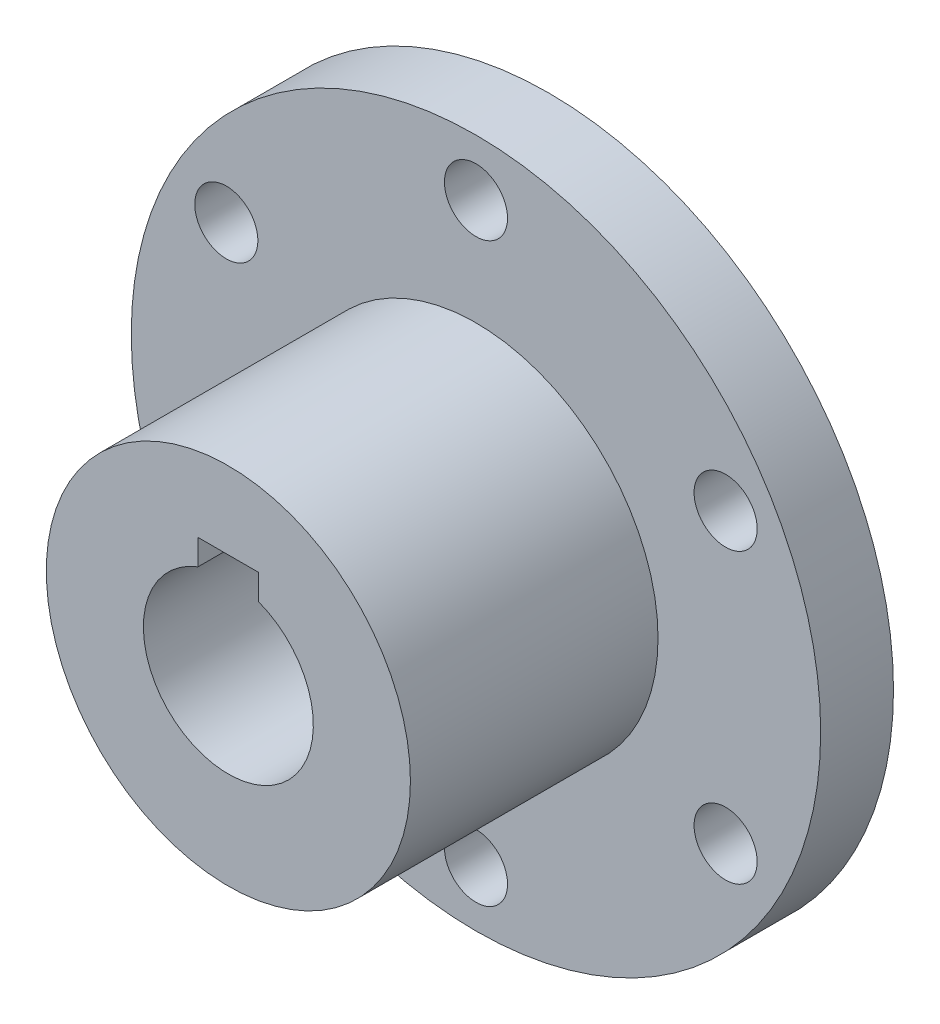
ISO-10303-21;
HEADER;
FILE_DESCRIPTION(('STEP AP214'),'2;1');
FILE_NAME('part.step','',(''),(''),'','','');
FILE_SCHEMA(('AUTOMOTIVE_DESIGN { 1 0 10303 214 1 1 1 1 }'));
ENDSEC;
DATA;
#1=APPLICATION_CONTEXT('core data for automotive mechanical design processes');
#2=APPLICATION_PROTOCOL_DEFINITION('international standard','automotive_design',2000,#1);
#3=PRODUCT_CONTEXT('',#1,'mechanical');
#4=PRODUCT('Part','Part','',(#3));
#5=PRODUCT_RELATED_PRODUCT_CATEGORY('part','',(#4));
#6=PRODUCT_DEFINITION_FORMATION('','',#4);
#7=PRODUCT_DEFINITION_CONTEXT('part definition',#1,'design');
#8=PRODUCT_DEFINITION('design','',#6,#7);
#9=PRODUCT_DEFINITION_SHAPE('','',#8);
#10=(LENGTH_UNIT() NAMED_UNIT(*) SI_UNIT(.MILLI.,.METRE.));
#11=(NAMED_UNIT(*) PLANE_ANGLE_UNIT() SI_UNIT($,.RADIAN.));
#12=(NAMED_UNIT(*) SI_UNIT($,.STERADIAN.) SOLID_ANGLE_UNIT());
#13=UNCERTAINTY_MEASURE_WITH_UNIT(LENGTH_MEASURE(1.E-05),#10,'distance_accuracy_value','');
#14=(GEOMETRIC_REPRESENTATION_CONTEXT(3) GLOBAL_UNCERTAINTY_ASSIGNED_CONTEXT((#13)) GLOBAL_UNIT_ASSIGNED_CONTEXT((#10,
#11,#12)) REPRESENTATION_CONTEXT('',''));
#15=CARTESIAN_POINT('',(0.,0.,0.));
#16=DIRECTION('',(0.,0.,1.));
#17=DIRECTION('',(1.,0.,0.));
#18=AXIS2_PLACEMENT_3D('',#15,#16,#17);
#19=CARTESIAN_POINT('',(0.,8.73301489862968,6.));
#20=DIRECTION('',(0.,0.,-1.));
#21=DIRECTION('',(-1.,0.,0.));
#22=AXIS2_PLACEMENT_3D('',#19,#20,#21);
#23=CYLINDRICAL_SURFACE('',#22,28.4);
#24=CARTESIAN_POINT('',(0.,8.73301489862968,6.));
#25=DIRECTION('',(0.,0.,1.));
#26=DIRECTION('',(1.,0.,0.));
#27=AXIS2_PLACEMENT_3D('',#24,#25,#26);
#28=CIRCLE('',#27,28.4);
#29=CARTESIAN_POINT('',(28.4,8.73301489862968,6.));
#30=VERTEX_POINT('',#29);
#31=EDGE_CURVE('E11',#30,#30,#28,.T.);
#32=ORIENTED_EDGE('',*,*,#31,.F.);
#33=EDGE_LOOP('',(#32));
#34=FACE_BOUND('',#33,.T.);
#35=CARTESIAN_POINT('',(0.,8.73301489862968,0.));
#36=DIRECTION('',(0.,0.,1.));
#37=DIRECTION('',(1.,0.,0.));
#38=AXIS2_PLACEMENT_3D('',#35,#36,#37);
#39=CIRCLE('',#38,28.4);
#40=CARTESIAN_POINT('',(28.4,8.73301489862968,0.));
#41=VERTEX_POINT('',#40);
#42=EDGE_CURVE('E38',#41,#41,#39,.T.);
#43=ORIENTED_EDGE('',*,*,#42,.T.);
#44=EDGE_LOOP('',(#43));
#45=FACE_BOUND('',#44,.T.);
#46=ADVANCED_FACE('F35',(#34,#45),#23,.T.);
#47=CARTESIAN_POINT('',(0.,8.73301489862968,6.));
#48=DIRECTION('',(0.,0.,1.));
#49=DIRECTION('',(1.,0.,0.));
#50=AXIS2_PLACEMENT_3D('',#47,#48,#49);
#51=PLANE('',#50);
#52=CARTESIAN_POINT('',(20.5681033398809,20.6080148986305,6.));
#53=DIRECTION('',(0.,0.,1.));
#54=DIRECTION('',(1.,0.,0.));
#55=AXIS2_PLACEMENT_3D('',#52,#53,#54);
#56=CIRCLE('',#55,2.6);
#57=CARTESIAN_POINT('',(23.168103339881,20.6080148986305,6.));
#58=VERTEX_POINT('',#57);
#59=EDGE_CURVE('E189',#58,#58,#56,.T.);
#60=ORIENTED_EDGE('',*,*,#59,.F.);
#61=EDGE_LOOP('',(#60));
#62=FACE_BOUND('',#61,.T.);
#63=CARTESIAN_POINT('',(20.5681033398819,-3.14198510136954,6.));
#64=DIRECTION('',(0.,0.,1.));
#65=DIRECTION('',(1.,0.,0.));
#66=AXIS2_PLACEMENT_3D('',#63,#64,#65);
#67=CIRCLE('',#66,2.6);
#68=CARTESIAN_POINT('',(23.1681033398819,-3.14198510136954,6.));
#69=VERTEX_POINT('',#68);
#70=EDGE_CURVE('E195',#69,#69,#67,.T.);
#71=ORIENTED_EDGE('',*,*,#70,.F.);
#72=EDGE_LOOP('',(#71));
#73=FACE_BOUND('',#72,.T.);
#74=CARTESIAN_POINT('',(1.85047582487731E-12,-15.0169851013703,6.));
#75=DIRECTION('',(0.,0.,1.));
#76=DIRECTION('',(1.,0.,0.));
#77=AXIS2_PLACEMENT_3D('',#74,#75,#76);
#78=CIRCLE('',#77,2.6);
#79=CARTESIAN_POINT('',(2.60000000000185,-15.0169851013703,6.));
#80=VERTEX_POINT('',#79);
#81=EDGE_CURVE('E203',#80,#80,#78,.T.);
#82=ORIENTED_EDGE('',*,*,#81,.F.);
#83=EDGE_LOOP('',(#82));
#84=FACE_BOUND('',#83,.T.);
#85=CARTESIAN_POINT('',(-20.568103339879,-3.14198510137101,6.));
#86=DIRECTION('',(0.,0.,1.));
#87=DIRECTION('',(1.,0.,0.));
#88=AXIS2_PLACEMENT_3D('',#85,#86,#87);
#89=CIRCLE('',#88,2.6);
#90=CARTESIAN_POINT('',(-17.968103339879,-3.14198510137101,6.));
#91=VERTEX_POINT('',#90);
#92=EDGE_CURVE('E209',#91,#91,#89,.T.);
#93=ORIENTED_EDGE('',*,*,#92,.F.);
#94=EDGE_LOOP('',(#93));
#95=FACE_BOUND('',#94,.T.);
#96=CARTESIAN_POINT('',(-20.5681033398798,20.6080148986291,6.));
#97=DIRECTION('',(0.,0.,1.));
#98=DIRECTION('',(1.,0.,0.));
#99=AXIS2_PLACEMENT_3D('',#96,#97,#98);
#100=CIRCLE('',#99,2.6);
#101=CARTESIAN_POINT('',(-17.9681033398798,20.6080148986291,6.));
#102=VERTEX_POINT('',#101);
#103=EDGE_CURVE('E215',#102,#102,#100,.T.);
#104=ORIENTED_EDGE('',*,*,#103,.F.);
#105=EDGE_LOOP('',(#104));
#106=FACE_BOUND('',#105,.T.);
#107=CARTESIAN_POINT('',(0.,32.4830148986297,6.));
#108=DIRECTION('',(0.,0.,1.));
#109=DIRECTION('',(1.,0.,0.));
#110=AXIS2_PLACEMENT_3D('',#107,#108,#109);
#111=CIRCLE('',#110,2.6);
#112=CARTESIAN_POINT('',(2.6,32.4830148986297,6.));
#113=VERTEX_POINT('',#112);
#114=EDGE_CURVE('E192',#113,#113,#111,.T.);
#115=ORIENTED_EDGE('',*,*,#114,.F.);
#116=EDGE_LOOP('',(#115));
#117=FACE_BOUND('',#116,.T.);
#118=CARTESIAN_POINT('',(0.,8.73301489862969,6.));
#119=DIRECTION('',(0.,0.,1.));
#120=DIRECTION('',(1.,0.,0.));
#121=AXIS2_PLACEMENT_3D('',#118,#119,#120);
#122=CIRCLE('',#121,15.);
#123=CARTESIAN_POINT('',(15.,8.73301489862969,6.));
#124=VERTEX_POINT('',#123);
#125=EDGE_CURVE('E112',#124,#124,#122,.T.);
#126=ORIENTED_EDGE('',*,*,#125,.F.);
#127=EDGE_LOOP('',(#126));
#128=FACE_BOUND('',#127,.T.);
#129=ORIENTED_EDGE('',*,*,#31,.T.);
#130=EDGE_LOOP('',(#129));
#131=FACE_BOUND('',#130,.T.);
#132=ADVANCED_FACE('F123',(#62,#73,#84,#95,#106,#117,#128,#131),#51,.T.);
#133=CARTESIAN_POINT('',(0.,8.73301489862968,0.));
#134=DIRECTION('',(0.,0.,1.));
#135=DIRECTION('',(1.,0.,0.));
#136=AXIS2_PLACEMENT_3D('',#133,#134,#135);
#137=PLANE('',#136);
#138=CARTESIAN_POINT('',(20.5681033398809,20.6080148986305,0.));
#139=DIRECTION('',(0.,0.,1.));
#140=DIRECTION('',(1.,0.,0.));
#141=AXIS2_PLACEMENT_3D('',#138,#139,#140);
#142=CIRCLE('',#141,2.6);
#143=CARTESIAN_POINT('',(23.168103339881,20.6080148986305,0.));
#144=VERTEX_POINT('',#143);
#145=EDGE_CURVE('E186',#144,#144,#142,.T.);
#146=ORIENTED_EDGE('',*,*,#145,.T.);
#147=EDGE_LOOP('',(#146));
#148=FACE_BOUND('',#147,.T.);
#149=CARTESIAN_POINT('',(20.5681033398819,-3.14198510136954,0.));
#150=DIRECTION('',(0.,0.,1.));
#151=DIRECTION('',(1.,0.,0.));
#152=AXIS2_PLACEMENT_3D('',#149,#150,#151);
#153=CIRCLE('',#152,2.6);
#154=CARTESIAN_POINT('',(23.1681033398819,-3.14198510136954,0.));
#155=VERTEX_POINT('',#154);
#156=EDGE_CURVE('E190',#155,#155,#153,.T.);
#157=ORIENTED_EDGE('',*,*,#156,.T.);
#158=EDGE_LOOP('',(#157));
#159=FACE_BOUND('',#158,.T.);
#160=CARTESIAN_POINT('',(1.85047582487731E-12,-15.0169851013703,0.));
#161=DIRECTION('',(0.,0.,1.));
#162=DIRECTION('',(1.,0.,0.));
#163=AXIS2_PLACEMENT_3D('',#160,#161,#162);
#164=CIRCLE('',#163,2.6);
#165=CARTESIAN_POINT('',(2.60000000000185,-15.0169851013703,0.));
#166=VERTEX_POINT('',#165);
#167=EDGE_CURVE('E200',#166,#166,#164,.T.);
#168=ORIENTED_EDGE('',*,*,#167,.T.);
#169=EDGE_LOOP('',(#168));
#170=FACE_BOUND('',#169,.T.);
#171=CARTESIAN_POINT('',(-20.568103339879,-3.14198510137101,0.));
#172=DIRECTION('',(0.,0.,1.));
#173=DIRECTION('',(1.,0.,0.));
#174=AXIS2_PLACEMENT_3D('',#171,#172,#173);
#175=CIRCLE('',#174,2.6);
#176=CARTESIAN_POINT('',(-17.968103339879,-3.14198510137101,0.));
#177=VERTEX_POINT('',#176);
#178=EDGE_CURVE('E206',#177,#177,#175,.T.);
#179=ORIENTED_EDGE('',*,*,#178,.T.);
#180=EDGE_LOOP('',(#179));
#181=FACE_BOUND('',#180,.T.);
#182=CARTESIAN_POINT('',(-20.5681033398798,20.6080148986291,0.));
#183=DIRECTION('',(0.,0.,1.));
#184=DIRECTION('',(1.,0.,0.));
#185=AXIS2_PLACEMENT_3D('',#182,#183,#184);
#186=CIRCLE('',#185,2.6);
#187=CARTESIAN_POINT('',(-17.9681033398798,20.6080148986291,0.));
#188=VERTEX_POINT('',#187);
#189=EDGE_CURVE('E212',#188,#188,#186,.T.);
#190=ORIENTED_EDGE('',*,*,#189,.T.);
#191=EDGE_LOOP('',(#190));
#192=FACE_BOUND('',#191,.T.);
#193=CARTESIAN_POINT('',(0.,32.4830148986297,0.));
#194=DIRECTION('',(0.,0.,1.));
#195=DIRECTION('',(1.,0.,0.));
#196=AXIS2_PLACEMENT_3D('',#193,#194,#195);
#197=CIRCLE('',#196,2.6);
#198=CARTESIAN_POINT('',(2.6,32.4830148986297,0.));
#199=VERTEX_POINT('',#198);
#200=EDGE_CURVE('E103',#199,#199,#197,.T.);
#201=ORIENTED_EDGE('',*,*,#200,.T.);
#202=EDGE_LOOP('',(#201));
#203=FACE_BOUND('',#202,.T.);
#204=CARTESIAN_POINT('',(0.,8.73301489862969,0.));
#205=DIRECTION('',(0.,0.,1.));
#206=DIRECTION('',(1.,0.,0.));
#207=AXIS2_PLACEMENT_3D('',#204,#205,#206);
#208=CIRCLE('',#207,7.);
#209=CARTESIAN_POINT('',(-2.5,15.2713633139407,0.));
#210=VERTEX_POINT('',#209);
#211=CARTESIAN_POINT('',(2.5,15.2713633139407,0.));
#212=VERTEX_POINT('',#211);
#213=EDGE_CURVE('E110',#210,#212,#208,.T.);
#214=ORIENTED_EDGE('',*,*,#213,.T.);
#215=DIRECTION('',(0.,1.,0.));
#216=VECTOR('',#215,1.);
#217=CARTESIAN_POINT('',(2.5,17.3713633139407,0.));
#218=LINE('',#217,#216);
#219=CARTESIAN_POINT('',(2.5,17.3713633139407,0.));
#220=VERTEX_POINT('',#219);
#221=EDGE_CURVE('E58',#212,#220,#218,.T.);
#222=ORIENTED_EDGE('',*,*,#221,.T.);
#223=DIRECTION('',(-1.,0.,0.));
#224=VECTOR('',#223,1.);
#225=CARTESIAN_POINT('',(-2.5,17.3713633139407,0.));
#226=LINE('',#225,#224);
#227=CARTESIAN_POINT('',(-2.5,17.3713633139407,0.));
#228=VERTEX_POINT('',#227);
#229=EDGE_CURVE('E83',#220,#228,#226,.T.);
#230=ORIENTED_EDGE('',*,*,#229,.T.);
#231=DIRECTION('',(0.,-1.,0.));
#232=VECTOR('',#231,1.);
#233=CARTESIAN_POINT('',(-2.5,15.2713633139407,0.));
#234=LINE('',#233,#232);
#235=EDGE_CURVE('E89',#228,#210,#234,.T.);
#236=ORIENTED_EDGE('',*,*,#235,.T.);
#237=EDGE_LOOP('',(#214,#222,#230,#236));
#238=FACE_BOUND('',#237,.T.);
#239=ORIENTED_EDGE('',*,*,#42,.F.);
#240=EDGE_LOOP('',(#239));
#241=FACE_BOUND('',#240,.T.);
#242=ADVANCED_FACE('F95',(#148,#159,#170,#181,#192,#203,#238,#241),#137,.F.);
#243=CARTESIAN_POINT('',(0.,8.73301489862969,26.4));
#244=DIRECTION('',(0.,0.,-1.));
#245=DIRECTION('',(-1.,0.,0.));
#246=AXIS2_PLACEMENT_3D('',#243,#244,#245);
#247=CYLINDRICAL_SURFACE('',#246,15.);
#248=CARTESIAN_POINT('',(0.,8.73301489862969,26.4));
#249=DIRECTION('',(0.,0.,1.));
#250=DIRECTION('',(1.,0.,0.));
#251=AXIS2_PLACEMENT_3D('',#248,#249,#250);
#252=CIRCLE('',#251,15.);
#253=CARTESIAN_POINT('',(15.,8.73301489862969,26.4));
#254=VERTEX_POINT('',#253);
#255=EDGE_CURVE('E115',#254,#254,#252,.T.);
#256=ORIENTED_EDGE('',*,*,#255,.F.);
#257=EDGE_LOOP('',(#256));
#258=FACE_BOUND('',#257,.T.);
#259=ORIENTED_EDGE('',*,*,#125,.T.);
#260=EDGE_LOOP('',(#259));
#261=FACE_BOUND('',#260,.T.);
#262=ADVANCED_FACE('F121',(#258,#261),#247,.T.);
#263=CARTESIAN_POINT('',(0.,8.73301489862969,26.4));
#264=DIRECTION('',(0.,0.,1.));
#265=DIRECTION('',(1.,0.,0.));
#266=AXIS2_PLACEMENT_3D('',#263,#264,#265);
#267=PLANE('',#266);
#268=DIRECTION('',(0.,1.,0.));
#269=VECTOR('',#268,1.);
#270=CARTESIAN_POINT('',(2.5,17.3713633139407,26.4));
#271=LINE('',#270,#269);
#272=CARTESIAN_POINT('',(2.5,15.2713633139407,26.4));
#273=VERTEX_POINT('',#272);
#274=CARTESIAN_POINT('',(2.5,17.3713633139407,26.4));
#275=VERTEX_POINT('',#274);
#276=EDGE_CURVE('E101',#273,#275,#271,.T.);
#277=ORIENTED_EDGE('',*,*,#276,.F.);
#278=CARTESIAN_POINT('',(0.,8.73301489862969,26.4));
#279=DIRECTION('',(0.,0.,1.));
#280=DIRECTION('',(1.,0.,0.));
#281=AXIS2_PLACEMENT_3D('',#278,#279,#280);
#282=CIRCLE('',#281,7.);
#283=CARTESIAN_POINT('',(-2.5,15.2713633139407,26.4));
#284=VERTEX_POINT('',#283);
#285=EDGE_CURVE('E107',#284,#273,#282,.T.);
#286=ORIENTED_EDGE('',*,*,#285,.F.);
#287=DIRECTION('',(0.,-1.,0.));
#288=VECTOR('',#287,1.);
#289=CARTESIAN_POINT('',(-2.5,15.2713633139407,26.4));
#290=LINE('',#289,#288);
#291=CARTESIAN_POINT('',(-2.5,17.3713633139407,26.4));
#292=VERTEX_POINT('',#291);
#293=EDGE_CURVE('E49',#292,#284,#290,.T.);
#294=ORIENTED_EDGE('',*,*,#293,.F.);
#295=DIRECTION('',(-1.,0.,0.));
#296=VECTOR('',#295,1.);
#297=CARTESIAN_POINT('',(-2.5,17.3713633139407,26.4));
#298=LINE('',#297,#296);
#299=EDGE_CURVE('E85',#275,#292,#298,.T.);
#300=ORIENTED_EDGE('',*,*,#299,.F.);
#301=EDGE_LOOP('',(#277,#286,#294,#300));
#302=FACE_BOUND('',#301,.T.);
#303=ORIENTED_EDGE('',*,*,#255,.T.);
#304=EDGE_LOOP('',(#303));
#305=FACE_BOUND('',#304,.T.);
#306=ADVANCED_FACE('F139',(#302,#305),#267,.T.);
#307=CARTESIAN_POINT('',(0.,8.73301489862969,0.));
#308=DIRECTION('',(0.,0.,1.));
#309=DIRECTION('',(1.,0.,0.));
#310=AXIS2_PLACEMENT_3D('',#307,#308,#309);
#311=CYLINDRICAL_SURFACE('',#310,7.);
#312=ORIENTED_EDGE('',*,*,#285,.T.);
#313=DIRECTION('',(0.,0.,1.));
#314=VECTOR('',#313,1.);
#315=CARTESIAN_POINT('',(2.5,15.2713633139407,0.));
#316=LINE('',#315,#314);
#317=EDGE_CURVE('E71',#212,#273,#316,.T.);
#318=ORIENTED_EDGE('',*,*,#317,.F.);
#319=ORIENTED_EDGE('',*,*,#213,.F.);
#320=DIRECTION('',(0.,0.,1.));
#321=VECTOR('',#320,1.);
#322=CARTESIAN_POINT('',(-2.5,15.2713633139407,0.));
#323=LINE('',#322,#321);
#324=EDGE_CURVE('E86',#210,#284,#323,.T.);
#325=ORIENTED_EDGE('',*,*,#324,.T.);
#326=EDGE_LOOP('',(#312,#318,#319,#325));
#327=FACE_BOUND('',#326,.T.);
#328=ADVANCED_FACE('F147',(#327),#311,.F.);
#329=CARTESIAN_POINT('',(2.5,17.3713633139407,0.));
#330=DIRECTION('',(1.,0.,0.));
#331=DIRECTION('',(0.,1.,0.));
#332=AXIS2_PLACEMENT_3D('',#329,#330,#331);
#333=PLANE('',#332);
#334=ORIENTED_EDGE('',*,*,#276,.T.);
#335=DIRECTION('',(0.,0.,1.));
#336=VECTOR('',#335,1.);
#337=CARTESIAN_POINT('',(2.5,17.3713633139407,0.));
#338=LINE('',#337,#336);
#339=EDGE_CURVE('E74',#220,#275,#338,.T.);
#340=ORIENTED_EDGE('',*,*,#339,.F.);
#341=ORIENTED_EDGE('',*,*,#221,.F.);
#342=ORIENTED_EDGE('',*,*,#317,.T.);
#343=EDGE_LOOP('',(#334,#340,#341,#342));
#344=FACE_BOUND('',#343,.T.);
#345=ADVANCED_FACE('F151',(#344),#333,.F.);
#346=CARTESIAN_POINT('',(-2.5,15.2713633139407,0.));
#347=DIRECTION('',(-1.,0.,0.));
#348=DIRECTION('',(0.,0.,1.));
#349=AXIS2_PLACEMENT_3D('',#346,#347,#348);
#350=PLANE('',#349);
#351=ORIENTED_EDGE('',*,*,#293,.T.);
#352=ORIENTED_EDGE('',*,*,#324,.F.);
#353=ORIENTED_EDGE('',*,*,#235,.F.);
#354=DIRECTION('',(0.,0.,1.));
#355=VECTOR('',#354,1.);
#356=CARTESIAN_POINT('',(-2.5,17.3713633139407,0.));
#357=LINE('',#356,#355);
#358=EDGE_CURVE('E79',#228,#292,#357,.T.);
#359=ORIENTED_EDGE('',*,*,#358,.T.);
#360=EDGE_LOOP('',(#351,#352,#353,#359));
#361=FACE_BOUND('',#360,.T.);
#362=ADVANCED_FACE('F90',(#361),#350,.F.);
#363=CARTESIAN_POINT('',(-2.5,17.3713633139407,0.));
#364=DIRECTION('',(0.,1.,0.));
#365=DIRECTION('',(0.,0.,1.));
#366=AXIS2_PLACEMENT_3D('',#363,#364,#365);
#367=PLANE('',#366);
#368=ORIENTED_EDGE('',*,*,#299,.T.);
#369=ORIENTED_EDGE('',*,*,#358,.F.);
#370=ORIENTED_EDGE('',*,*,#229,.F.);
#371=ORIENTED_EDGE('',*,*,#339,.T.);
#372=EDGE_LOOP('',(#368,#369,#370,#371));
#373=FACE_BOUND('',#372,.T.);
#374=ADVANCED_FACE('F81',(#373),#367,.F.);
#375=CARTESIAN_POINT('',(0.,32.4830148986297,0.));
#376=DIRECTION('',(0.,0.,1.));
#377=DIRECTION('',(1.,0.,0.));
#378=AXIS2_PLACEMENT_3D('',#375,#376,#377);
#379=CYLINDRICAL_SURFACE('',#378,2.6);
#380=ORIENTED_EDGE('',*,*,#200,.F.);
#381=EDGE_LOOP('',(#380));
#382=FACE_BOUND('',#381,.T.);
#383=ORIENTED_EDGE('',*,*,#114,.T.);
#384=EDGE_LOOP('',(#383));
#385=FACE_BOUND('',#384,.T.);
#386=ADVANCED_FACE('F157',(#382,#385),#379,.F.);
#387=CARTESIAN_POINT('',(-20.5681033398798,20.6080148986291,0.));
#388=DIRECTION('',(0.,0.,1.));
#389=DIRECTION('',(1.,0.,0.));
#390=AXIS2_PLACEMENT_3D('',#387,#388,#389);
#391=CYLINDRICAL_SURFACE('',#390,2.6);
#392=ORIENTED_EDGE('',*,*,#189,.F.);
#393=EDGE_LOOP('',(#392));
#394=FACE_BOUND('',#393,.T.);
#395=ORIENTED_EDGE('',*,*,#103,.T.);
#396=EDGE_LOOP('',(#395));
#397=FACE_BOUND('',#396,.T.);
#398=ADVANCED_FACE('F162',(#394,#397),#391,.F.);
#399=CARTESIAN_POINT('',(-20.568103339879,-3.14198510137101,0.));
#400=DIRECTION('',(0.,0.,1.));
#401=DIRECTION('',(1.,0.,0.));
#402=AXIS2_PLACEMENT_3D('',#399,#400,#401);
#403=CYLINDRICAL_SURFACE('',#402,2.6);
#404=ORIENTED_EDGE('',*,*,#178,.F.);
#405=EDGE_LOOP('',(#404));
#406=FACE_BOUND('',#405,.T.);
#407=ORIENTED_EDGE('',*,*,#92,.T.);
#408=EDGE_LOOP('',(#407));
#409=FACE_BOUND('',#408,.T.);
#410=ADVANCED_FACE('F166',(#406,#409),#403,.F.);
#411=CARTESIAN_POINT('',(1.85047582487731E-12,-15.0169851013703,0.));
#412=DIRECTION('',(0.,0.,1.));
#413=DIRECTION('',(1.,0.,0.));
#414=AXIS2_PLACEMENT_3D('',#411,#412,#413);
#415=CYLINDRICAL_SURFACE('',#414,2.6);
#416=ORIENTED_EDGE('',*,*,#167,.F.);
#417=EDGE_LOOP('',(#416));
#418=FACE_BOUND('',#417,.T.);
#419=ORIENTED_EDGE('',*,*,#81,.T.);
#420=EDGE_LOOP('',(#419));
#421=FACE_BOUND('',#420,.T.);
#422=ADVANCED_FACE('F170',(#418,#421),#415,.F.);
#423=CARTESIAN_POINT('',(20.5681033398819,-3.14198510136954,0.));
#424=DIRECTION('',(0.,0.,1.));
#425=DIRECTION('',(1.,0.,0.));
#426=AXIS2_PLACEMENT_3D('',#423,#424,#425);
#427=CYLINDRICAL_SURFACE('',#426,2.6);
#428=ORIENTED_EDGE('',*,*,#156,.F.);
#429=EDGE_LOOP('',(#428));
#430=FACE_BOUND('',#429,.T.);
#431=ORIENTED_EDGE('',*,*,#70,.T.);
#432=EDGE_LOOP('',(#431));
#433=FACE_BOUND('',#432,.T.);
#434=ADVANCED_FACE('F174',(#430,#433),#427,.F.);
#435=CARTESIAN_POINT('',(20.5681033398809,20.6080148986305,0.));
#436=DIRECTION('',(0.,0.,1.));
#437=DIRECTION('',(1.,0.,0.));
#438=AXIS2_PLACEMENT_3D('',#435,#436,#437);
#439=CYLINDRICAL_SURFACE('',#438,2.6);
#440=ORIENTED_EDGE('',*,*,#145,.F.);
#441=EDGE_LOOP('',(#440));
#442=FACE_BOUND('',#441,.T.);
#443=ORIENTED_EDGE('',*,*,#59,.T.);
#444=EDGE_LOOP('',(#443));
#445=FACE_BOUND('',#444,.T.);
#446=ADVANCED_FACE('F178',(#442,#445),#439,.F.);
#447=CLOSED_SHELL('',(#46,#132,#242,#262,#306,#328,#345,#362,#374,#386,#398,#410,#422,#434,#446));
#448=MANIFOLD_SOLID_BREP('B2',#447);
#449=ADVANCED_BREP_SHAPE_REPRESENTATION('',(#18,#448),#14);
#450=SHAPE_DEFINITION_REPRESENTATION(#9,#449);
ENDSEC;
END-ISO-10303-21;
